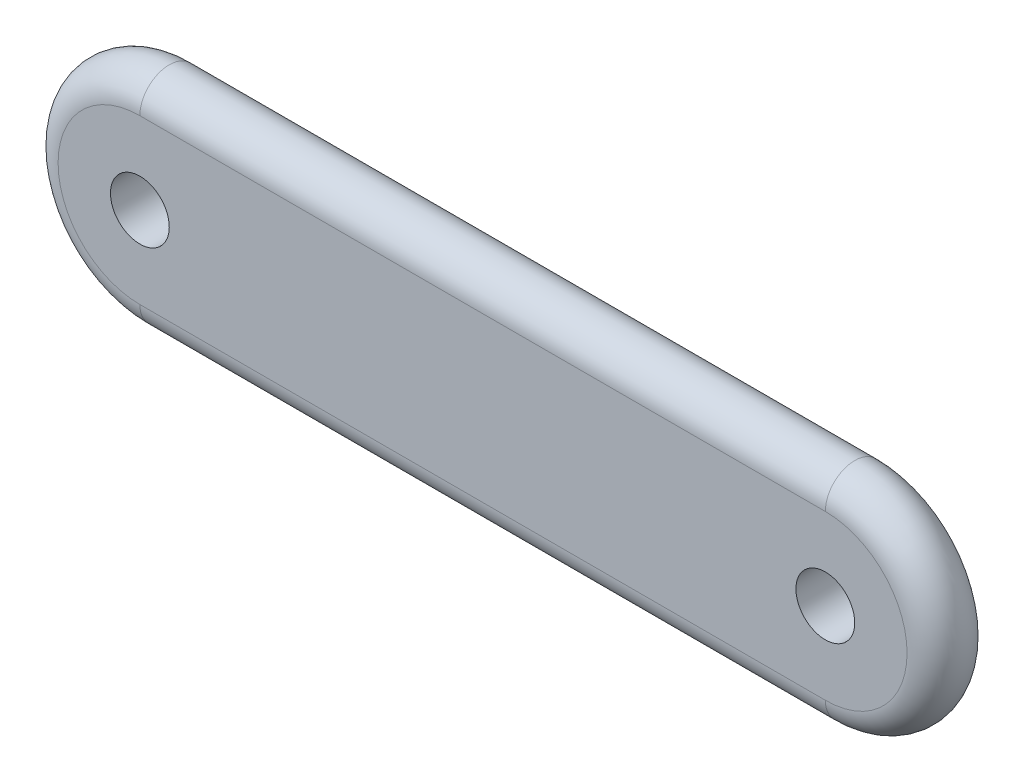
ISO-10303-21;
HEADER;
FILE_DESCRIPTION(('STEP AP214'),'2;1');
FILE_NAME('part.step','',(''),(''),'','','');
FILE_SCHEMA(('AUTOMOTIVE_DESIGN { 1 0 10303 214 1 1 1 1 }'));
ENDSEC;
DATA;
#1=APPLICATION_CONTEXT('core data for automotive mechanical design processes');
#2=APPLICATION_PROTOCOL_DEFINITION('international standard','automotive_design',2000,#1);
#3=PRODUCT_CONTEXT('',#1,'mechanical');
#4=PRODUCT('Part','Part','',(#3));
#5=PRODUCT_RELATED_PRODUCT_CATEGORY('part','',(#4));
#6=PRODUCT_DEFINITION_FORMATION('','',#4);
#7=PRODUCT_DEFINITION_CONTEXT('part definition',#1,'design');
#8=PRODUCT_DEFINITION('design','',#6,#7);
#9=PRODUCT_DEFINITION_SHAPE('','',#8);
#10=(LENGTH_UNIT() NAMED_UNIT(*) SI_UNIT(.MILLI.,.METRE.));
#11=(NAMED_UNIT(*) PLANE_ANGLE_UNIT() SI_UNIT($,.RADIAN.));
#12=(NAMED_UNIT(*) SI_UNIT($,.STERADIAN.) SOLID_ANGLE_UNIT());
#13=UNCERTAINTY_MEASURE_WITH_UNIT(LENGTH_MEASURE(1.E-05),#10,'distance_accuracy_value','');
#14=(GEOMETRIC_REPRESENTATION_CONTEXT(3) GLOBAL_UNCERTAINTY_ASSIGNED_CONTEXT((#13)) GLOBAL_UNIT_ASSIGNED_CONTEXT((#10,
#11,#12)) REPRESENTATION_CONTEXT('',''));
#15=CARTESIAN_POINT('',(0.,0.,0.));
#16=DIRECTION('',(0.,0.,1.));
#17=DIRECTION('',(1.,0.,0.));
#18=AXIS2_PLACEMENT_3D('',#15,#16,#17);
#19=CARTESIAN_POINT('',(-37.000000041,-8.82499987599998,3.175));
#20=DIRECTION('',(1.,0.,0.));
#21=DIRECTION('',(0.,0.,-1.));
#22=AXIS2_PLACEMENT_3D('',#19,#20,#21);
#23=CYLINDRICAL_SURFACE('',#22,3.175);
#24=CARTESIAN_POINT('',(37.000000041,-8.82499987599996,3.175));
#25=DIRECTION('',(1.,0.,0.));
#26=DIRECTION('',(0.,0.,-1.));
#27=AXIS2_PLACEMENT_3D('',#24,#25,#26);
#28=CIRCLE('',#27,3.175);
#29=CARTESIAN_POINT('',(37.000000041,-8.82499987599996,6.35));
#30=VERTEX_POINT('',#29);
#31=CARTESIAN_POINT('',(37.000000041,-8.82499987599996,0.));
#32=VERTEX_POINT('',#31);
#33=EDGE_CURVE('E11',#30,#32,#28,.T.);
#34=ORIENTED_EDGE('',*,*,#33,.F.);
#35=DIRECTION('',(-1.,0.,0.));
#36=VECTOR('',#35,1.);
#37=CARTESIAN_POINT('',(-37.000000041,-8.82499987599998,6.35));
#38=LINE('',#37,#36);
#39=CARTESIAN_POINT('',(-37.000000041,-8.82499987599998,6.35));
#40=VERTEX_POINT('',#39);
#41=EDGE_CURVE('E89',#40,#30,#38,.F.);
#42=ORIENTED_EDGE('',*,*,#41,.F.);
#43=CARTESIAN_POINT('',(-37.000000041,-8.82499987599998,3.175));
#44=DIRECTION('',(1.,0.,0.));
#45=DIRECTION('',(0.,0.,-1.));
#46=AXIS2_PLACEMENT_3D('',#43,#44,#45);
#47=CIRCLE('',#46,3.175);
#48=CARTESIAN_POINT('',(-37.000000041,-8.82499987599998,0.));
#49=VERTEX_POINT('',#48);
#50=EDGE_CURVE('E44',#40,#49,#47,.T.);
#51=ORIENTED_EDGE('',*,*,#50,.T.);
#52=DIRECTION('',(1.,0.,0.));
#53=VECTOR('',#52,1.);
#54=CARTESIAN_POINT('',(-37.000000041,-8.82499987599998,0.));
#55=LINE('',#54,#53);
#56=EDGE_CURVE('E103',#32,#49,#55,.F.);
#57=ORIENTED_EDGE('',*,*,#56,.F.);
#58=EDGE_LOOP('',(#34,#42,#51,#57));
#59=FACE_BOUND('',#58,.T.);
#60=ADVANCED_FACE('F36',(#59),#23,.T.);
#61=CARTESIAN_POINT('',(-37.000000041,0.,3.175));
#62=DIRECTION('',(0.,0.,1.));
#63=DIRECTION('',(1.,0.,0.));
#64=AXIS2_PLACEMENT_3D('',#61,#62,#63);
#65=TOROIDAL_SURFACE('',#64,8.82499987599998,3.175);
#66=ORIENTED_EDGE('',*,*,#50,.F.);
#67=CARTESIAN_POINT('',(-37.000000041,0.,6.35));
#68=DIRECTION('',(0.,0.,1.));
#69=DIRECTION('',(1.,0.,0.));
#70=AXIS2_PLACEMENT_3D('',#67,#68,#69);
#71=CIRCLE('',#70,8.82499987599998);
#72=CARTESIAN_POINT('',(-37.000000041,8.82499987599998,6.35));
#73=VERTEX_POINT('',#72);
#74=EDGE_CURVE('E76',#73,#40,#71,.T.);
#75=ORIENTED_EDGE('',*,*,#74,.F.);
#76=CARTESIAN_POINT('',(-37.000000041,8.82499987599998,3.175));
#77=DIRECTION('',(-1.,0.,0.));
#78=DIRECTION('',(0.,-1.,0.));
#79=AXIS2_PLACEMENT_3D('',#76,#77,#78);
#80=CIRCLE('',#79,3.175);
#81=CARTESIAN_POINT('',(-37.000000041,8.82499987599998,0.));
#82=VERTEX_POINT('',#81);
#83=EDGE_CURVE('E59',#73,#82,#80,.T.);
#84=ORIENTED_EDGE('',*,*,#83,.T.);
#85=CARTESIAN_POINT('',(-37.000000041,0.,0.));
#86=DIRECTION('',(0.,0.,1.));
#87=DIRECTION('',(1.,0.,0.));
#88=AXIS2_PLACEMENT_3D('',#85,#86,#87);
#89=CIRCLE('',#88,8.82499987599998);
#90=EDGE_CURVE('E78',#49,#82,#89,.F.);
#91=ORIENTED_EDGE('',*,*,#90,.F.);
#92=EDGE_LOOP('',(#66,#75,#84,#91));
#93=FACE_BOUND('',#92,.T.);
#94=ADVANCED_FACE('F75',(#93),#65,.T.);
#95=CARTESIAN_POINT('',(37.000000041,8.82499987599998,3.175));
#96=DIRECTION('',(-1.,0.,0.));
#97=DIRECTION('',(0.,0.,1.));
#98=AXIS2_PLACEMENT_3D('',#95,#96,#97);
#99=CYLINDRICAL_SURFACE('',#98,3.175);
#100=ORIENTED_EDGE('',*,*,#83,.F.);
#101=DIRECTION('',(1.,0.,0.));
#102=VECTOR('',#101,1.);
#103=CARTESIAN_POINT('',(37.000000041,8.82499987599998,6.35));
#104=LINE('',#103,#102);
#105=CARTESIAN_POINT('',(37.000000041,8.82499987599998,6.35));
#106=VERTEX_POINT('',#105);
#107=EDGE_CURVE('E90',#106,#73,#104,.F.);
#108=ORIENTED_EDGE('',*,*,#107,.F.);
#109=CARTESIAN_POINT('',(37.000000041,8.82499987599998,3.175));
#110=DIRECTION('',(-1.,0.,0.));
#111=DIRECTION('',(0.,0.,1.));
#112=AXIS2_PLACEMENT_3D('',#109,#110,#111);
#113=CIRCLE('',#112,3.175);
#114=CARTESIAN_POINT('',(37.000000041,8.82499987599998,0.));
#115=VERTEX_POINT('',#114);
#116=EDGE_CURVE('E51',#106,#115,#113,.T.);
#117=ORIENTED_EDGE('',*,*,#116,.T.);
#118=DIRECTION('',(-1.,0.,0.));
#119=VECTOR('',#118,1.);
#120=CARTESIAN_POINT('',(-37.000000041,8.82499987599998,0.));
#121=LINE('',#120,#119);
#122=EDGE_CURVE('E106',#82,#115,#121,.F.);
#123=ORIENTED_EDGE('',*,*,#122,.F.);
#124=EDGE_LOOP('',(#100,#108,#117,#123));
#125=FACE_BOUND('',#124,.T.);
#126=ADVANCED_FACE('F118',(#125),#99,.T.);
#127=CARTESIAN_POINT('',(37.000000041,0.,3.175));
#128=DIRECTION('',(0.,0.,1.));
#129=DIRECTION('',(1.,0.,0.));
#130=AXIS2_PLACEMENT_3D('',#127,#128,#129);
#131=TOROIDAL_SURFACE('',#130,8.82499987599998,3.175);
#132=CARTESIAN_POINT('',(37.000000041,0.,6.35));
#133=DIRECTION('',(0.,0.,1.));
#134=DIRECTION('',(1.,0.,0.));
#135=AXIS2_PLACEMENT_3D('',#132,#133,#134);
#136=CIRCLE('',#135,8.82499987599998);
#137=EDGE_CURVE('E101',#30,#106,#136,.T.);
#138=ORIENTED_EDGE('',*,*,#137,.F.);
#139=ORIENTED_EDGE('',*,*,#33,.T.);
#140=CARTESIAN_POINT('',(37.000000041,0.,0.));
#141=DIRECTION('',(0.,0.,1.));
#142=DIRECTION('',(1.,0.,0.));
#143=AXIS2_PLACEMENT_3D('',#140,#141,#142);
#144=CIRCLE('',#143,8.82499987599998);
#145=EDGE_CURVE('E109',#115,#32,#144,.F.);
#146=ORIENTED_EDGE('',*,*,#145,.F.);
#147=ORIENTED_EDGE('',*,*,#116,.F.);
#148=EDGE_LOOP('',(#138,#139,#146,#147));
#149=FACE_BOUND('',#148,.T.);
#150=ADVANCED_FACE('F117',(#149),#131,.T.);
#151=CARTESIAN_POINT('',(-37.000000041,0.,6.35));
#152=DIRECTION('',(0.,0.,1.));
#153=DIRECTION('',(1.,0.,0.));
#154=AXIS2_PLACEMENT_3D('',#151,#152,#153);
#155=PLANE('',#154);
#156=ORIENTED_EDGE('',*,*,#41,.T.);
#157=ORIENTED_EDGE('',*,*,#137,.T.);
#158=ORIENTED_EDGE('',*,*,#107,.T.);
#159=ORIENTED_EDGE('',*,*,#74,.T.);
#160=EDGE_LOOP('',(#156,#157,#158,#159));
#161=FACE_BOUND('',#160,.T.);
#162=CARTESIAN_POINT('',(-37.000000041,0.,6.35));
#163=DIRECTION('',(0.,0.,1.));
#164=DIRECTION('',(1.,0.,0.));
#165=AXIS2_PLACEMENT_3D('',#162,#163,#164);
#166=CIRCLE('',#165,3.17499999999995);
#167=CARTESIAN_POINT('',(-33.8250000410001,0.,6.35));
#168=VERTEX_POINT('',#167);
#169=EDGE_CURVE('E200',#168,#168,#166,.T.);
#170=ORIENTED_EDGE('',*,*,#169,.F.);
#171=EDGE_LOOP('',(#170));
#172=FACE_BOUND('',#171,.T.);
#173=CARTESIAN_POINT('',(37.000000041,0.,6.35));
#174=DIRECTION('',(0.,0.,1.));
#175=DIRECTION('',(1.,0.,0.));
#176=AXIS2_PLACEMENT_3D('',#173,#174,#175);
#177=CIRCLE('',#176,3.17499999999995);
#178=CARTESIAN_POINT('',(40.175000041,0.,6.35));
#179=VERTEX_POINT('',#178);
#180=EDGE_CURVE('E96',#179,#179,#177,.T.);
#181=ORIENTED_EDGE('',*,*,#180,.F.);
#182=EDGE_LOOP('',(#181));
#183=FACE_BOUND('',#182,.T.);
#184=ADVANCED_FACE('F86',(#161,#172,#183),#155,.T.);
#185=CARTESIAN_POINT('',(-37.000000041,0.,0.));
#186=DIRECTION('',(0.,0.,1.));
#187=DIRECTION('',(1.,0.,0.));
#188=AXIS2_PLACEMENT_3D('',#185,#186,#187);
#189=PLANE('',#188);
#190=ORIENTED_EDGE('',*,*,#122,.T.);
#191=ORIENTED_EDGE('',*,*,#145,.T.);
#192=ORIENTED_EDGE('',*,*,#56,.T.);
#193=ORIENTED_EDGE('',*,*,#90,.T.);
#194=EDGE_LOOP('',(#190,#191,#192,#193));
#195=FACE_BOUND('',#194,.T.);
#196=CARTESIAN_POINT('',(-37.000000041,0.,0.));
#197=DIRECTION('',(0.,0.,1.));
#198=DIRECTION('',(1.,0.,0.));
#199=AXIS2_PLACEMENT_3D('',#196,#197,#198);
#200=CIRCLE('',#199,3.17499999999995);
#201=CARTESIAN_POINT('',(-33.8250000410001,0.,0.));
#202=VERTEX_POINT('',#201);
#203=EDGE_CURVE('E197',#202,#202,#200,.T.);
#204=ORIENTED_EDGE('',*,*,#203,.T.);
#205=EDGE_LOOP('',(#204));
#206=FACE_BOUND('',#205,.T.);
#207=CARTESIAN_POINT('',(37.000000041,0.,0.));
#208=DIRECTION('',(0.,0.,1.));
#209=DIRECTION('',(1.,0.,0.));
#210=AXIS2_PLACEMENT_3D('',#207,#208,#209);
#211=CIRCLE('',#210,3.17499999999995);
#212=CARTESIAN_POINT('',(40.175000041,0.,0.));
#213=VERTEX_POINT('',#212);
#214=EDGE_CURVE('E93',#213,#213,#211,.T.);
#215=ORIENTED_EDGE('',*,*,#214,.T.);
#216=EDGE_LOOP('',(#215));
#217=FACE_BOUND('',#216,.T.);
#218=ADVANCED_FACE('F114',(#195,#206,#217),#189,.F.);
#219=CARTESIAN_POINT('',(37.000000041,0.,6.35));
#220=DIRECTION('',(0.,0.,1.));
#221=DIRECTION('',(1.,0.,0.));
#222=AXIS2_PLACEMENT_3D('',#219,#220,#221);
#223=CYLINDRICAL_SURFACE('',#222,3.17499999999995);
#224=ORIENTED_EDGE('',*,*,#214,.F.);
#225=EDGE_LOOP('',(#224));
#226=FACE_BOUND('',#225,.T.);
#227=ORIENTED_EDGE('',*,*,#180,.T.);
#228=EDGE_LOOP('',(#227));
#229=FACE_BOUND('',#228,.T.);
#230=ADVANCED_FACE('F162',(#226,#229),#223,.F.);
#231=CARTESIAN_POINT('',(-37.000000041,0.,6.35));
#232=DIRECTION('',(0.,0.,1.));
#233=DIRECTION('',(1.,0.,0.));
#234=AXIS2_PLACEMENT_3D('',#231,#232,#233);
#235=CYLINDRICAL_SURFACE('',#234,3.17499999999995);
#236=ORIENTED_EDGE('',*,*,#203,.F.);
#237=EDGE_LOOP('',(#236));
#238=FACE_BOUND('',#237,.T.);
#239=ORIENTED_EDGE('',*,*,#169,.T.);
#240=EDGE_LOOP('',(#239));
#241=FACE_BOUND('',#240,.T.);
#242=ADVANCED_FACE('F172',(#238,#241),#235,.F.);
#243=CLOSED_SHELL('',(#60,#94,#126,#150,#184,#218,#230,#242));
#244=MANIFOLD_SOLID_BREP('B2',#243);
#245=ADVANCED_BREP_SHAPE_REPRESENTATION('',(#18,#244),#14);
#246=SHAPE_DEFINITION_REPRESENTATION(#9,#245);
ENDSEC;
END-ISO-10303-21;
